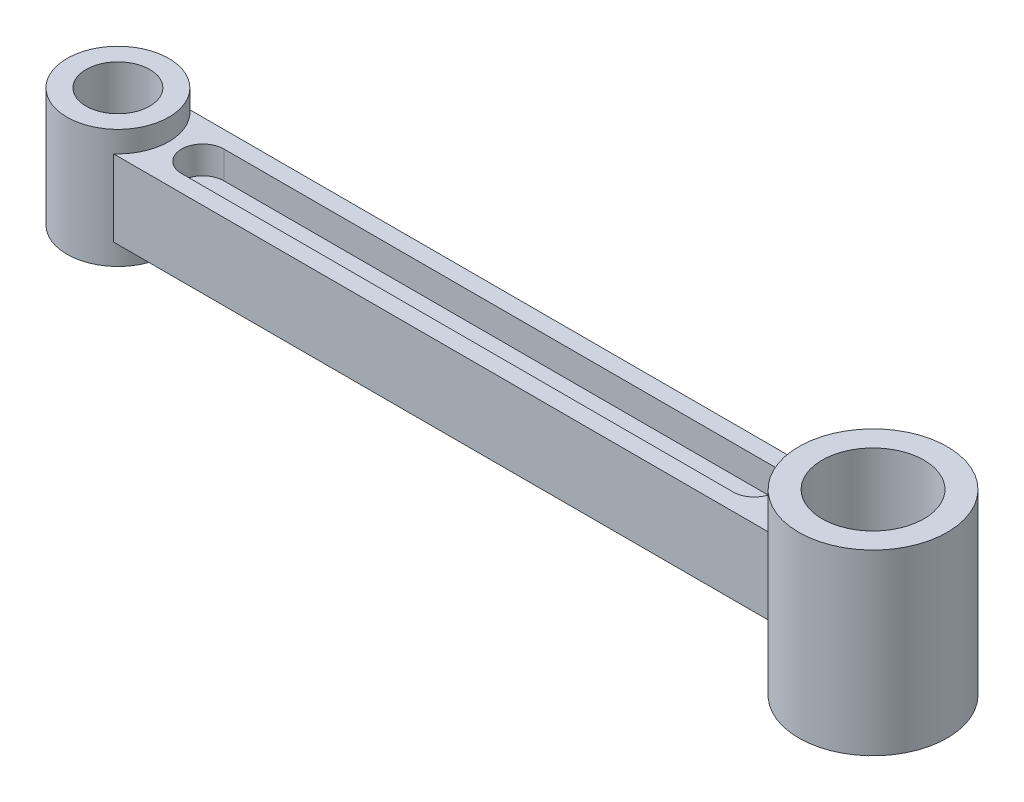
ISO-10303-21;
HEADER;
FILE_DESCRIPTION(('STEP AP214'),'2;1');
FILE_NAME('part.step','',(''),(''),'','','');
FILE_SCHEMA(('AUTOMOTIVE_DESIGN { 1 0 10303 214 1 1 1 1 }'));
ENDSEC;
DATA;
#1=APPLICATION_CONTEXT('core data for automotive mechanical design processes');
#2=APPLICATION_PROTOCOL_DEFINITION('international standard','automotive_design',2000,#1);
#3=PRODUCT_CONTEXT('',#1,'mechanical');
#4=PRODUCT('Part','Part','',(#3));
#5=PRODUCT_RELATED_PRODUCT_CATEGORY('part','',(#4));
#6=PRODUCT_DEFINITION_FORMATION('','',#4);
#7=PRODUCT_DEFINITION_CONTEXT('part definition',#1,'design');
#8=PRODUCT_DEFINITION('design','',#6,#7);
#9=PRODUCT_DEFINITION_SHAPE('','',#8);
#10=(LENGTH_UNIT() NAMED_UNIT(*) SI_UNIT(.MILLI.,.METRE.));
#11=(NAMED_UNIT(*) PLANE_ANGLE_UNIT() SI_UNIT($,.RADIAN.));
#12=(NAMED_UNIT(*) SI_UNIT($,.STERADIAN.) SOLID_ANGLE_UNIT());
#13=UNCERTAINTY_MEASURE_WITH_UNIT(LENGTH_MEASURE(1.E-05),#10,'distance_accuracy_value','');
#14=(GEOMETRIC_REPRESENTATION_CONTEXT(3) GLOBAL_UNCERTAINTY_ASSIGNED_CONTEXT((#13)) GLOBAL_UNIT_ASSIGNED_CONTEXT((#10,
#11,#12)) REPRESENTATION_CONTEXT('',''));
#15=CARTESIAN_POINT('',(0.,0.,0.));
#16=DIRECTION('',(0.,0.,1.));
#17=DIRECTION('',(1.,0.,0.));
#18=AXIS2_PLACEMENT_3D('',#15,#16,#17);
#19=CARTESIAN_POINT('',(69.003011604365,-8.99999999999999,0.));
#20=DIRECTION('',(0.,-1.,0.));
#21=DIRECTION('',(0.,0.,-1.));
#22=AXIS2_PLACEMENT_3D('',#19,#20,#21);
#23=PLANE('',#22);
#24=CARTESIAN_POINT('',(69.003011604365,-8.99999999999999,0.));
#25=DIRECTION('',(0.,-1.,0.));
#26=DIRECTION('',(0.,0.,-1.));
#27=AXIS2_PLACEMENT_3D('',#24,#25,#26);
#28=CIRCLE('',#27,17.5);
#29=CARTESIAN_POINT('',(53.9946805845614,-8.99999999999999,9.00000000000001));
#30=VERTEX_POINT('',#29);
#31=CARTESIAN_POINT('',(53.9946805845614,-8.99999999999999,-9.00000000000001));
#32=VERTEX_POINT('',#31);
#33=EDGE_CURVE('E240',#30,#32,#28,.T.);
#34=ORIENTED_EDGE('',*,*,#33,.F.);
#35=DIRECTION('',(1.,0.,0.));
#36=VECTOR('',#35,1.);
#37=CARTESIAN_POINT('',(53.9946805845614,-8.99999999999999,9.00000000000001));
#38=LINE('',#37,#36);
#39=CARTESIAN_POINT('',(-101.059734462441,-8.99999999999999,9.00000000000001));
#40=VERTEX_POINT('',#39);
#41=EDGE_CURVE('E249',#40,#30,#38,.T.);
#42=ORIENTED_EDGE('',*,*,#41,.F.);
#43=CARTESIAN_POINT('',(-108.996988395635,-8.99999999999999,0.));
#44=DIRECTION('',(0.,-1.,0.));
#45=DIRECTION('',(0.,0.,-1.));
#46=AXIS2_PLACEMENT_3D('',#43,#44,#45);
#47=CIRCLE('',#46,12.);
#48=CARTESIAN_POINT('',(-101.059734462441,-8.99999999999999,-9.00000000000001));
#49=VERTEX_POINT('',#48);
#50=EDGE_CURVE('E265',#49,#40,#47,.T.);
#51=ORIENTED_EDGE('',*,*,#50,.F.);
#52=DIRECTION('',(-1.,0.,0.));
#53=VECTOR('',#52,1.);
#54=CARTESIAN_POINT('',(53.9946805845614,-8.99999999999999,-9.00000000000001));
#55=LINE('',#54,#53);
#56=EDGE_CURVE('E262',#32,#49,#55,.T.);
#57=ORIENTED_EDGE('',*,*,#56,.F.);
#58=EDGE_LOOP('',(#34,#42,#51,#57));
#59=FACE_BOUND('',#58,.T.);
#60=DIRECTION('',(-1.,0.,0.));
#61=VECTOR('',#60,1.);
#62=CARTESIAN_POINT('',(-88.996988395635,-8.99999999999999,-5.));
#63=LINE('',#62,#61);
#64=CARTESIAN_POINT('',(41.003011604365,-8.99999999999999,-5.));
#65=VERTEX_POINT('',#64);
#66=CARTESIAN_POINT('',(-88.996988395635,-8.99999999999999,-5.));
#67=VERTEX_POINT('',#66);
#68=EDGE_CURVE('E171',#65,#67,#63,.T.);
#69=ORIENTED_EDGE('',*,*,#68,.T.);
#70=CARTESIAN_POINT('',(-88.996988395635,-8.99999999999999,0.));
#71=DIRECTION('',(0.,1.,0.));
#72=DIRECTION('',(0.,0.,1.));
#73=AXIS2_PLACEMENT_3D('',#70,#71,#72);
#74=CIRCLE('',#73,5.);
#75=CARTESIAN_POINT('',(-88.996988395635,-8.99999999999999,5.));
#76=VERTEX_POINT('',#75);
#77=EDGE_CURVE('E59',#67,#76,#74,.T.);
#78=ORIENTED_EDGE('',*,*,#77,.T.);
#79=DIRECTION('',(1.,0.,0.));
#80=VECTOR('',#79,1.);
#81=CARTESIAN_POINT('',(41.003011604365,-8.99999999999999,4.99999999999998));
#82=LINE('',#81,#80);
#83=CARTESIAN_POINT('',(41.003011604365,-8.99999999999999,5.));
#84=VERTEX_POINT('',#83);
#85=EDGE_CURVE('E156',#76,#84,#82,.T.);
#86=ORIENTED_EDGE('',*,*,#85,.T.);
#87=CARTESIAN_POINT('',(41.003011604365,-8.99999999999999,0.));
#88=DIRECTION('',(0.,1.,0.));
#89=DIRECTION('',(0.,0.,1.));
#90=AXIS2_PLACEMENT_3D('',#87,#88,#89);
#91=CIRCLE('',#90,4.99999999999999);
#92=EDGE_CURVE('E162',#84,#65,#91,.T.);
#93=ORIENTED_EDGE('',*,*,#92,.T.);
#94=EDGE_LOOP('',(#69,#78,#86,#93));
#95=FACE_BOUND('',#94,.T.);
#96=ADVANCED_FACE('F43',(#59,#95),#23,.T.);
#97=CARTESIAN_POINT('',(-108.996988395635,14.,0.));
#98=DIRECTION('',(0.,-1.,0.));
#99=DIRECTION('',(0.,0.,-1.));
#100=AXIS2_PLACEMENT_3D('',#97,#98,#99);
#101=CYLINDRICAL_SURFACE('',#100,12.);
#102=CARTESIAN_POINT('',(-108.996988395635,-14.,0.));
#103=DIRECTION('',(0.,1.,0.));
#104=DIRECTION('',(0.,0.,1.));
#105=AXIS2_PLACEMENT_3D('',#102,#103,#104);
#106=CIRCLE('',#105,12.);
#107=CARTESIAN_POINT('',(-108.996988395635,-14.,12.));
#108=VERTEX_POINT('',#107);
#109=EDGE_CURVE('E47',#108,#108,#106,.T.);
#110=ORIENTED_EDGE('',*,*,#109,.T.);
#111=EDGE_LOOP('',(#110));
#112=FACE_BOUND('',#111,.T.);
#113=CARTESIAN_POINT('',(-108.996988395635,14.,0.));
#114=DIRECTION('',(0.,1.,0.));
#115=DIRECTION('',(0.,0.,1.));
#116=AXIS2_PLACEMENT_3D('',#113,#114,#115);
#117=CIRCLE('',#116,12.);
#118=CARTESIAN_POINT('',(-108.996988395635,14.,12.));
#119=VERTEX_POINT('',#118);
#120=EDGE_CURVE('E11',#119,#119,#117,.T.);
#121=ORIENTED_EDGE('',*,*,#120,.F.);
#122=EDGE_LOOP('',(#121));
#123=FACE_BOUND('',#122,.T.);
#124=CARTESIAN_POINT('',(-108.996988395635,9.00000000000001,0.));
#125=DIRECTION('',(0.,-1.,0.));
#126=DIRECTION('',(0.,0.,-1.));
#127=AXIS2_PLACEMENT_3D('',#124,#125,#126);
#128=CIRCLE('',#127,12.);
#129=CARTESIAN_POINT('',(-101.059734462441,9.00000000000001,-9.00000000000001));
#130=VERTEX_POINT('',#129);
#131=CARTESIAN_POINT('',(-101.059734462441,9.00000000000001,9.00000000000001));
#132=VERTEX_POINT('',#131);
#133=EDGE_CURVE('E252',#130,#132,#128,.T.);
#134=ORIENTED_EDGE('',*,*,#133,.F.);
#135=DIRECTION('',(0.,-1.,0.));
#136=VECTOR('',#135,1.);
#137=CARTESIAN_POINT('',(-101.059734462441,9.00000000000001,-9.00000000000001));
#138=LINE('',#137,#136);
#139=EDGE_CURVE('E278',#130,#49,#138,.T.);
#140=ORIENTED_EDGE('',*,*,#139,.T.);
#141=ORIENTED_EDGE('',*,*,#50,.T.);
#142=DIRECTION('',(0.,-1.,0.));
#143=VECTOR('',#142,1.);
#144=CARTESIAN_POINT('',(-101.059734462441,9.00000000000001,9.00000000000001));
#145=LINE('',#144,#143);
#146=EDGE_CURVE('E274',#132,#40,#145,.T.);
#147=ORIENTED_EDGE('',*,*,#146,.F.);
#148=EDGE_LOOP('',(#134,#140,#141,#147));
#149=FACE_BOUND('',#148,.T.);
#150=ADVANCED_FACE('F45',(#112,#123,#149),#101,.T.);
#151=CARTESIAN_POINT('',(-108.996988395635,14.,0.));
#152=DIRECTION('',(0.,1.,0.));
#153=DIRECTION('',(0.,0.,1.));
#154=AXIS2_PLACEMENT_3D('',#151,#152,#153);
#155=PLANE('',#154);
#156=ORIENTED_EDGE('',*,*,#120,.T.);
#157=EDGE_LOOP('',(#156));
#158=FACE_BOUND('',#157,.T.);
#159=CARTESIAN_POINT('',(-108.996988395635,14.,0.));
#160=DIRECTION('',(0.,1.,0.));
#161=DIRECTION('',(0.,0.,1.));
#162=AXIS2_PLACEMENT_3D('',#159,#160,#161);
#163=CIRCLE('',#162,7.5);
#164=CARTESIAN_POINT('',(-108.996988395635,14.,7.5));
#165=VERTEX_POINT('',#164);
#166=EDGE_CURVE('E286',#165,#165,#163,.T.);
#167=ORIENTED_EDGE('',*,*,#166,.F.);
#168=EDGE_LOOP('',(#167));
#169=FACE_BOUND('',#168,.T.);
#170=ADVANCED_FACE('F310',(#158,#169),#155,.T.);
#171=CARTESIAN_POINT('',(-108.996988395635,-14.,0.));
#172=DIRECTION('',(0.,1.,0.));
#173=DIRECTION('',(0.,0.,1.));
#174=AXIS2_PLACEMENT_3D('',#171,#172,#173);
#175=PLANE('',#174);
#176=ORIENTED_EDGE('',*,*,#109,.F.);
#177=EDGE_LOOP('',(#176));
#178=FACE_BOUND('',#177,.T.);
#179=CARTESIAN_POINT('',(-108.996988395635,-14.,0.));
#180=DIRECTION('',(0.,1.,0.));
#181=DIRECTION('',(0.,0.,1.));
#182=AXIS2_PLACEMENT_3D('',#179,#180,#181);
#183=CIRCLE('',#182,7.5);
#184=CARTESIAN_POINT('',(-108.996988395635,-14.,7.5));
#185=VERTEX_POINT('',#184);
#186=EDGE_CURVE('E285',#185,#185,#183,.T.);
#187=ORIENTED_EDGE('',*,*,#186,.T.);
#188=EDGE_LOOP('',(#187));
#189=FACE_BOUND('',#188,.T.);
#190=ADVANCED_FACE('F296',(#178,#189),#175,.F.);
#191=CARTESIAN_POINT('',(-108.996988395635,14.,0.));
#192=DIRECTION('',(0.,-1.,0.));
#193=DIRECTION('',(0.,0.,-1.));
#194=AXIS2_PLACEMENT_3D('',#191,#192,#193);
#195=CYLINDRICAL_SURFACE('',#194,7.5);
#196=ORIENTED_EDGE('',*,*,#166,.T.);
#197=EDGE_LOOP('',(#196));
#198=FACE_BOUND('',#197,.T.);
#199=ORIENTED_EDGE('',*,*,#186,.F.);
#200=EDGE_LOOP('',(#199));
#201=FACE_BOUND('',#200,.T.);
#202=ADVANCED_FACE('F298',(#198,#201),#195,.F.);
#203=CARTESIAN_POINT('',(53.9946805845614,9.00000000000001,-9.00000000000001));
#204=DIRECTION('',(0.,0.,1.));
#205=DIRECTION('',(1.,0.,0.));
#206=AXIS2_PLACEMENT_3D('',#203,#204,#205);
#207=PLANE('',#206);
#208=ORIENTED_EDGE('',*,*,#56,.T.);
#209=ORIENTED_EDGE('',*,*,#139,.F.);
#210=DIRECTION('',(-1.,0.,0.));
#211=VECTOR('',#210,1.);
#212=CARTESIAN_POINT('',(53.9946805845614,9.00000000000001,-9.00000000000001));
#213=LINE('',#212,#211);
#214=CARTESIAN_POINT('',(53.9946805845614,9.00000000000001,-9.00000000000001));
#215=VERTEX_POINT('',#214);
#216=EDGE_CURVE('E248',#215,#130,#213,.T.);
#217=ORIENTED_EDGE('',*,*,#216,.F.);
#218=DIRECTION('',(0.,-1.,0.));
#219=VECTOR('',#218,1.);
#220=CARTESIAN_POINT('',(53.9946805845614,9.00000000000001,-9.00000000000001));
#221=LINE('',#220,#219);
#222=EDGE_CURVE('E282',#215,#32,#221,.T.);
#223=ORIENTED_EDGE('',*,*,#222,.T.);
#224=EDGE_LOOP('',(#208,#209,#217,#223));
#225=FACE_BOUND('',#224,.T.);
#226=ADVANCED_FACE('F300',(#225),#207,.F.);
#227=CARTESIAN_POINT('',(53.9946805845614,9.00000000000001,9.00000000000001));
#228=DIRECTION('',(0.,0.,-1.));
#229=DIRECTION('',(-1.,0.,0.));
#230=AXIS2_PLACEMENT_3D('',#227,#228,#229);
#231=PLANE('',#230);
#232=ORIENTED_EDGE('',*,*,#41,.T.);
#233=DIRECTION('',(0.,-1.,0.));
#234=VECTOR('',#233,1.);
#235=CARTESIAN_POINT('',(53.9946805845614,9.00000000000001,9.00000000000001));
#236=LINE('',#235,#234);
#237=CARTESIAN_POINT('',(53.9946805845614,9.00000000000001,9.00000000000001));
#238=VERTEX_POINT('',#237);
#239=EDGE_CURVE('E258',#238,#30,#236,.T.);
#240=ORIENTED_EDGE('',*,*,#239,.F.);
#241=DIRECTION('',(1.,0.,0.));
#242=VECTOR('',#241,1.);
#243=CARTESIAN_POINT('',(53.9946805845614,9.00000000000001,9.00000000000001));
#244=LINE('',#243,#242);
#245=EDGE_CURVE('E255',#132,#238,#244,.T.);
#246=ORIENTED_EDGE('',*,*,#245,.F.);
#247=ORIENTED_EDGE('',*,*,#146,.T.);
#248=EDGE_LOOP('',(#232,#240,#246,#247));
#249=FACE_BOUND('',#248,.T.);
#250=ADVANCED_FACE('F307',(#249),#231,.F.);
#251=CARTESIAN_POINT('',(69.003011604365,9.00000000000001,0.));
#252=DIRECTION('',(0.,-1.,0.));
#253=DIRECTION('',(0.,0.,-1.));
#254=AXIS2_PLACEMENT_3D('',#251,#252,#253);
#255=PLANE('',#254);
#256=DIRECTION('',(1.,0.,0.));
#257=VECTOR('',#256,1.);
#258=CARTESIAN_POINT('',(41.003011604365,9.00000000000001,4.99999999999998));
#259=LINE('',#258,#257);
#260=CARTESIAN_POINT('',(-88.996988395635,9.00000000000001,5.));
#261=VERTEX_POINT('',#260);
#262=CARTESIAN_POINT('',(41.003011604365,9.00000000000001,5.));
#263=VERTEX_POINT('',#262);
#264=EDGE_CURVE('E205',#261,#263,#259,.T.);
#265=ORIENTED_EDGE('',*,*,#264,.F.);
#266=CARTESIAN_POINT('',(-88.996988395635,9.00000000000001,0.));
#267=DIRECTION('',(0.,1.,0.));
#268=DIRECTION('',(0.,0.,1.));
#269=AXIS2_PLACEMENT_3D('',#266,#267,#268);
#270=CIRCLE('',#269,5.);
#271=CARTESIAN_POINT('',(-88.996988395635,9.00000000000001,-5.));
#272=VERTEX_POINT('',#271);
#273=EDGE_CURVE('E67',#272,#261,#270,.T.);
#274=ORIENTED_EDGE('',*,*,#273,.F.);
#275=DIRECTION('',(-1.,0.,0.));
#276=VECTOR('',#275,1.);
#277=CARTESIAN_POINT('',(-88.996988395635,9.00000000000001,-5.));
#278=LINE('',#277,#276);
#279=CARTESIAN_POINT('',(41.003011604365,9.00000000000001,-5.));
#280=VERTEX_POINT('',#279);
#281=EDGE_CURVE('E190',#280,#272,#278,.T.);
#282=ORIENTED_EDGE('',*,*,#281,.F.);
#283=CARTESIAN_POINT('',(41.003011604365,9.00000000000001,0.));
#284=DIRECTION('',(0.,1.,0.));
#285=DIRECTION('',(0.,0.,1.));
#286=AXIS2_PLACEMENT_3D('',#283,#284,#285);
#287=CIRCLE('',#286,4.99999999999999);
#288=EDGE_CURVE('E209',#263,#280,#287,.T.);
#289=ORIENTED_EDGE('',*,*,#288,.F.);
#290=EDGE_LOOP('',(#265,#274,#282,#289));
#291=FACE_BOUND('',#290,.T.);
#292=CARTESIAN_POINT('',(69.003011604365,9.00000000000001,0.));
#293=DIRECTION('',(0.,-1.,0.));
#294=DIRECTION('',(0.,0.,-1.));
#295=AXIS2_PLACEMENT_3D('',#292,#293,#294);
#296=CIRCLE('',#295,17.5);
#297=EDGE_CURVE('E244',#238,#215,#296,.T.);
#298=ORIENTED_EDGE('',*,*,#297,.T.);
#299=ORIENTED_EDGE('',*,*,#216,.T.);
#300=ORIENTED_EDGE('',*,*,#133,.T.);
#301=ORIENTED_EDGE('',*,*,#245,.T.);
#302=EDGE_LOOP('',(#298,#299,#300,#301));
#303=FACE_BOUND('',#302,.T.);
#304=ADVANCED_FACE('F324',(#291,#303),#255,.F.);
#305=CARTESIAN_POINT('',(69.003011604365,21.,0.));
#306=DIRECTION('',(0.,-1.,0.));
#307=DIRECTION('',(0.,0.,-1.));
#308=AXIS2_PLACEMENT_3D('',#305,#306,#307);
#309=CYLINDRICAL_SURFACE('',#308,17.5);
#310=CARTESIAN_POINT('',(69.003011604365,21.,0.));
#311=DIRECTION('',(0.,1.,0.));
#312=DIRECTION('',(0.,0.,1.));
#313=AXIS2_PLACEMENT_3D('',#310,#311,#312);
#314=CIRCLE('',#313,17.5);
#315=CARTESIAN_POINT('',(69.003011604365,21.,17.5));
#316=VERTEX_POINT('',#315);
#317=EDGE_CURVE('E236',#316,#316,#314,.T.);
#318=ORIENTED_EDGE('',*,*,#317,.F.);
#319=EDGE_LOOP('',(#318));
#320=FACE_BOUND('',#319,.T.);
#321=CARTESIAN_POINT('',(69.003011604365,-21.,0.));
#322=DIRECTION('',(0.,1.,0.));
#323=DIRECTION('',(0.,0.,1.));
#324=AXIS2_PLACEMENT_3D('',#321,#322,#323);
#325=CIRCLE('',#324,17.5);
#326=CARTESIAN_POINT('',(69.003011604365,-21.,17.5));
#327=VERTEX_POINT('',#326);
#328=EDGE_CURVE('E232',#327,#327,#325,.T.);
#329=ORIENTED_EDGE('',*,*,#328,.T.);
#330=EDGE_LOOP('',(#329));
#331=FACE_BOUND('',#330,.T.);
#332=ORIENTED_EDGE('',*,*,#222,.F.);
#333=ORIENTED_EDGE('',*,*,#297,.F.);
#334=ORIENTED_EDGE('',*,*,#239,.T.);
#335=ORIENTED_EDGE('',*,*,#33,.T.);
#336=EDGE_LOOP('',(#332,#333,#334,#335));
#337=FACE_BOUND('',#336,.T.);
#338=ADVANCED_FACE('F331',(#320,#331,#337),#309,.T.);
#339=CARTESIAN_POINT('',(69.003011604365,21.,0.));
#340=DIRECTION('',(0.,1.,0.));
#341=DIRECTION('',(0.,0.,1.));
#342=AXIS2_PLACEMENT_3D('',#339,#340,#341);
#343=PLANE('',#342);
#344=ORIENTED_EDGE('',*,*,#317,.T.);
#345=EDGE_LOOP('',(#344));
#346=FACE_BOUND('',#345,.T.);
#347=CARTESIAN_POINT('',(69.003011604365,21.,0.));
#348=DIRECTION('',(0.,1.,0.));
#349=DIRECTION('',(0.,0.,1.));
#350=AXIS2_PLACEMENT_3D('',#347,#348,#349);
#351=CIRCLE('',#350,12.);
#352=CARTESIAN_POINT('',(69.003011604365,21.,-12.));
#353=VERTEX_POINT('',#352);
#354=EDGE_CURVE('E228',#353,#353,#351,.T.);
#355=ORIENTED_EDGE('',*,*,#354,.F.);
#356=EDGE_LOOP('',(#355));
#357=FACE_BOUND('',#356,.T.);
#358=ADVANCED_FACE('F346',(#346,#357),#343,.T.);
#359=CARTESIAN_POINT('',(69.003011604365,-21.,0.));
#360=DIRECTION('',(0.,1.,0.));
#361=DIRECTION('',(0.,0.,1.));
#362=AXIS2_PLACEMENT_3D('',#359,#360,#361);
#363=PLANE('',#362);
#364=ORIENTED_EDGE('',*,*,#328,.F.);
#365=EDGE_LOOP('',(#364));
#366=FACE_BOUND('',#365,.T.);
#367=CARTESIAN_POINT('',(69.003011604365,-21.,0.));
#368=DIRECTION('',(0.,1.,0.));
#369=DIRECTION('',(0.,0.,1.));
#370=AXIS2_PLACEMENT_3D('',#367,#368,#369);
#371=CIRCLE('',#370,12.);
#372=CARTESIAN_POINT('',(69.003011604365,-21.,-12.));
#373=VERTEX_POINT('',#372);
#374=EDGE_CURVE('E219',#373,#373,#371,.T.);
#375=ORIENTED_EDGE('',*,*,#374,.T.);
#376=EDGE_LOOP('',(#375));
#377=FACE_BOUND('',#376,.T.);
#378=ADVANCED_FACE('F351',(#366,#377),#363,.F.);
#379=CARTESIAN_POINT('',(69.003011604365,21.,0.));
#380=DIRECTION('',(0.,-1.,0.));
#381=DIRECTION('',(0.,0.,-1.));
#382=AXIS2_PLACEMENT_3D('',#379,#380,#381);
#383=CYLINDRICAL_SURFACE('',#382,12.);
#384=CARTESIAN_POINT('',(69.003011604365,21.,-12.));
#385=CARTESIAN_POINT('',(69.003011604365,20.5625,-12.));
#386=CARTESIAN_POINT('',(69.003011604365,20.125,-12.));
#387=CARTESIAN_POINT('',(69.003011604365,19.25,-12.));
#388=CARTESIAN_POINT('',(69.003011604365,18.8125,-12.));
#389=CARTESIAN_POINT('',(69.003011604365,17.9375,-12.));
#390=CARTESIAN_POINT('',(69.003011604365,17.5,-12.));
#391=CARTESIAN_POINT('',(69.003011604365,16.625,-12.));
#392=CARTESIAN_POINT('',(69.003011604365,16.1875,-12.));
#393=CARTESIAN_POINT('',(69.003011604365,15.3125,-12.));
#394=CARTESIAN_POINT('',(69.003011604365,14.875,-12.));
#395=CARTESIAN_POINT('',(69.003011604365,14.,-12.));
#396=CARTESIAN_POINT('',(69.003011604365,13.5625,-12.));
#397=CARTESIAN_POINT('',(69.003011604365,12.6875,-12.));
#398=CARTESIAN_POINT('',(69.003011604365,12.25,-12.));
#399=CARTESIAN_POINT('',(69.003011604365,11.375,-12.));
#400=CARTESIAN_POINT('',(69.003011604365,10.9375,-12.));
#401=CARTESIAN_POINT('',(69.003011604365,10.0625,-12.));
#402=CARTESIAN_POINT('',(69.003011604365,9.62499999999999,-12.));
#403=CARTESIAN_POINT('',(69.003011604365,8.74999999999999,-12.));
#404=CARTESIAN_POINT('',(69.003011604365,8.31249999999999,-12.));
#405=CARTESIAN_POINT('',(69.003011604365,7.43749999999999,-12.));
#406=CARTESIAN_POINT('',(69.003011604365,6.99999999999999,-12.));
#407=CARTESIAN_POINT('',(69.003011604365,6.12499999999999,-12.));
#408=CARTESIAN_POINT('',(69.003011604365,5.68749999999999,-12.));
#409=CARTESIAN_POINT('',(69.003011604365,4.81249999999999,-12.));
#410=CARTESIAN_POINT('',(69.003011604365,4.37499999999999,-12.));
#411=CARTESIAN_POINT('',(69.003011604365,3.49999999999999,-12.));
#412=CARTESIAN_POINT('',(69.003011604365,3.06249999999999,-12.));
#413=CARTESIAN_POINT('',(69.003011604365,2.18749999999999,-12.));
#414=CARTESIAN_POINT('',(69.003011604365,1.74999999999999,-12.));
#415=CARTESIAN_POINT('',(69.003011604365,0.874999999999987,-12.));
#416=CARTESIAN_POINT('',(69.003011604365,0.437499999999987,-12.));
#417=CARTESIAN_POINT('',(69.003011604365,-0.437500000000014,-12.));
#418=CARTESIAN_POINT('',(69.003011604365,-0.875000000000015,-12.));
#419=CARTESIAN_POINT('',(69.003011604365,-1.75000000000002,-12.));
#420=CARTESIAN_POINT('',(69.003011604365,-2.18750000000002,-12.));
#421=CARTESIAN_POINT('',(69.003011604365,-3.06250000000002,-12.));
#422=CARTESIAN_POINT('',(69.003011604365,-3.50000000000001,-12.));
#423=CARTESIAN_POINT('',(69.003011604365,-4.37500000000001,-12.));
#424=CARTESIAN_POINT('',(69.003011604365,-4.81250000000002,-12.));
#425=CARTESIAN_POINT('',(69.003011604365,-5.68750000000002,-12.));
#426=CARTESIAN_POINT('',(69.003011604365,-6.12500000000002,-12.));
#427=CARTESIAN_POINT('',(69.003011604365,-7.00000000000002,-12.));
#428=CARTESIAN_POINT('',(69.003011604365,-7.43750000000001,-12.));
#429=CARTESIAN_POINT('',(69.003011604365,-8.31250000000001,-12.));
#430=CARTESIAN_POINT('',(69.003011604365,-8.75000000000001,-12.));
#431=CARTESIAN_POINT('',(69.003011604365,-9.62500000000001,-12.));
#432=CARTESIAN_POINT('',(69.003011604365,-10.0625,-12.));
#433=CARTESIAN_POINT('',(69.003011604365,-10.9375,-12.));
#434=CARTESIAN_POINT('',(69.003011604365,-11.375,-12.));
#435=CARTESIAN_POINT('',(69.003011604365,-12.25,-12.));
#436=CARTESIAN_POINT('',(69.003011604365,-12.6875,-12.));
#437=CARTESIAN_POINT('',(69.003011604365,-13.5625,-12.));
#438=CARTESIAN_POINT('',(69.003011604365,-14.,-12.));
#439=CARTESIAN_POINT('',(69.003011604365,-14.875,-12.));
#440=CARTESIAN_POINT('',(69.003011604365,-15.3125,-12.));
#441=CARTESIAN_POINT('',(69.003011604365,-16.1875,-12.));
#442=CARTESIAN_POINT('',(69.003011604365,-16.625,-12.));
#443=CARTESIAN_POINT('',(69.003011604365,-17.5,-12.));
#444=CARTESIAN_POINT('',(69.003011604365,-17.9375,-12.));
#445=CARTESIAN_POINT('',(69.003011604365,-18.8125,-12.));
#446=CARTESIAN_POINT('',(69.003011604365,-19.25,-12.));
#447=CARTESIAN_POINT('',(69.003011604365,-20.125,-12.));
#448=CARTESIAN_POINT('',(69.003011604365,-20.5625,-12.));
#449=CARTESIAN_POINT('',(69.003011604365,-21.,-12.));
#450=B_SPLINE_CURVE_WITH_KNOTS('',3,(#384,#385,#386,#387,#388,#389,#390,#391,#392,#393,#394,
#395,#396,#397,#398,#399,#400,#401,#402,#403,#404,#405,#406,#407,#408,#409,#410,#411,#412,#413,
#414,#415,#416,#417,#418,#419,#420,#421,#422,#423,#424,#425,#426,#427,#428,#429,#430,#431,#432,
#433,#434,#435,#436,#437,#438,#439,#440,#441,#442,#443,#444,#445,#446,#447,#448,#449),
.UNSPECIFIED.,.F.,.F.,(4,2,2,2,2,2,2,2,2,2,2,2,2,2,2,2,2,2,2,2,2,2,2,2,2,2,2,2,2,2,2,2,4),(0.,
1.3125,2.625,3.9375,5.25,6.5625,7.875,9.1875,10.5,11.8125,13.125,14.4375,15.75,17.0625,18.375,
19.6875,21.,22.3125,23.625,24.9375,26.25,27.5625,28.875,30.1875,31.5,32.8125,34.125,35.4375,
36.75,38.0625,39.375,40.6875,42.),.UNSPECIFIED.);
#451=EDGE_CURVE('BSEAM358',#353,#373,#450,.T.);
#452=ORIENTED_EDGE('',*,*,#354,.T.);
#453=ORIENTED_EDGE('',*,*,#374,.F.);
#454=ORIENTED_EDGE('',*,*,#451,.T.);
#455=ORIENTED_EDGE('',*,*,#451,.F.);
#456=EDGE_LOOP('',(#452,#454,#453,#455));
#457=FACE_BOUND('',#456,.T.);
#458=ADVANCED_FACE('F358',(#457),#383,.F.);
#459=CARTESIAN_POINT('',(-88.996988395635,2.5,0.));
#460=DIRECTION('',(0.,1.,0.));
#461=DIRECTION('',(0.,0.,1.));
#462=AXIS2_PLACEMENT_3D('',#459,#460,#461);
#463=CYLINDRICAL_SURFACE('',#462,5.);
#464=ORIENTED_EDGE('',*,*,#273,.T.);
#465=DIRECTION('',(0.,1.,0.));
#466=VECTOR('',#465,1.);
#467=CARTESIAN_POINT('',(-88.996988395635,2.5,5.));
#468=LINE('',#467,#466);
#469=CARTESIAN_POINT('',(-88.996988395635,2.5,5.));
#470=VERTEX_POINT('',#469);
#471=EDGE_CURVE('E202',#470,#261,#468,.T.);
#472=ORIENTED_EDGE('',*,*,#471,.F.);
#473=CARTESIAN_POINT('',(-88.996988395635,2.5,0.));
#474=DIRECTION('',(0.,1.,0.));
#475=DIRECTION('',(0.,0.,1.));
#476=AXIS2_PLACEMENT_3D('',#473,#474,#475);
#477=CIRCLE('',#476,5.);
#478=CARTESIAN_POINT('',(-88.996988395635,2.5,-5.));
#479=VERTEX_POINT('',#478);
#480=EDGE_CURVE('E185',#479,#470,#477,.T.);
#481=ORIENTED_EDGE('',*,*,#480,.F.);
#482=DIRECTION('',(0.,1.,0.));
#483=VECTOR('',#482,1.);
#484=CARTESIAN_POINT('',(-88.996988395635,2.5,-5.));
#485=LINE('',#484,#483);
#486=EDGE_CURVE('E216',#479,#272,#485,.T.);
#487=ORIENTED_EDGE('',*,*,#486,.T.);
#488=EDGE_LOOP('',(#464,#472,#481,#487));
#489=FACE_BOUND('',#488,.T.);
#490=ADVANCED_FACE('F363',(#489),#463,.F.);
#491=CARTESIAN_POINT('',(-88.996988395635,2.5,-5.));
#492=DIRECTION('',(0.,0.,-1.));
#493=DIRECTION('',(-1.,0.,0.));
#494=AXIS2_PLACEMENT_3D('',#491,#492,#493);
#495=PLANE('',#494);
#496=ORIENTED_EDGE('',*,*,#281,.T.);
#497=ORIENTED_EDGE('',*,*,#486,.F.);
#498=DIRECTION('',(-1.,0.,0.));
#499=VECTOR('',#498,1.);
#500=CARTESIAN_POINT('',(-88.996988395635,2.5,-5.));
#501=LINE('',#500,#499);
#502=CARTESIAN_POINT('',(41.003011604365,2.5,-5.));
#503=VERTEX_POINT('',#502);
#504=EDGE_CURVE('E198',#503,#479,#501,.T.);
#505=ORIENTED_EDGE('',*,*,#504,.F.);
#506=DIRECTION('',(0.,1.,0.));
#507=VECTOR('',#506,1.);
#508=CARTESIAN_POINT('',(41.003011604365,2.5,-5.));
#509=LINE('',#508,#507);
#510=EDGE_CURVE('E220',#503,#280,#509,.T.);
#511=ORIENTED_EDGE('',*,*,#510,.T.);
#512=EDGE_LOOP('',(#496,#497,#505,#511));
#513=FACE_BOUND('',#512,.T.);
#514=ADVANCED_FACE('F367',(#513),#495,.F.);
#515=CARTESIAN_POINT('',(41.003011604365,2.5,0.));
#516=DIRECTION('',(0.,1.,0.));
#517=DIRECTION('',(0.,0.,1.));
#518=AXIS2_PLACEMENT_3D('',#515,#516,#517);
#519=CYLINDRICAL_SURFACE('',#518,4.99999999999999);
#520=ORIENTED_EDGE('',*,*,#288,.T.);
#521=ORIENTED_EDGE('',*,*,#510,.F.);
#522=CARTESIAN_POINT('',(41.003011604365,2.5,0.));
#523=DIRECTION('',(0.,1.,0.));
#524=DIRECTION('',(0.,0.,1.));
#525=AXIS2_PLACEMENT_3D('',#522,#523,#524);
#526=CIRCLE('',#525,4.99999999999999);
#527=CARTESIAN_POINT('',(41.003011604365,2.5,5.));
#528=VERTEX_POINT('',#527);
#529=EDGE_CURVE('E194',#528,#503,#526,.T.);
#530=ORIENTED_EDGE('',*,*,#529,.F.);
#531=DIRECTION('',(0.,1.,0.));
#532=VECTOR('',#531,1.);
#533=CARTESIAN_POINT('',(41.003011604365,2.5,5.));
#534=LINE('',#533,#532);
#535=EDGE_CURVE('E223',#528,#263,#534,.T.);
#536=ORIENTED_EDGE('',*,*,#535,.T.);
#537=EDGE_LOOP('',(#520,#521,#530,#536));
#538=FACE_BOUND('',#537,.T.);
#539=ADVANCED_FACE('F372',(#538),#519,.F.);
#540=CARTESIAN_POINT('',(41.003011604365,2.5,4.99999999999998));
#541=DIRECTION('',(0.,0.,1.));
#542=DIRECTION('',(1.,0.,0.));
#543=AXIS2_PLACEMENT_3D('',#540,#541,#542);
#544=PLANE('',#543);
#545=ORIENTED_EDGE('',*,*,#264,.T.);
#546=ORIENTED_EDGE('',*,*,#535,.F.);
#547=DIRECTION('',(1.,0.,0.));
#548=VECTOR('',#547,1.);
#549=CARTESIAN_POINT('',(41.003011604365,2.5,4.99999999999998));
#550=LINE('',#549,#548);
#551=EDGE_CURVE('E189',#470,#528,#550,.T.);
#552=ORIENTED_EDGE('',*,*,#551,.F.);
#553=ORIENTED_EDGE('',*,*,#471,.T.);
#554=EDGE_LOOP('',(#545,#546,#552,#553));
#555=FACE_BOUND('',#554,.T.);
#556=ADVANCED_FACE('F368',(#555),#544,.F.);
#557=CARTESIAN_POINT('',(-88.996988395635,2.5,0.));
#558=DIRECTION('',(0.,1.,0.));
#559=DIRECTION('',(0.,0.,1.));
#560=AXIS2_PLACEMENT_3D('',#557,#558,#559);
#561=PLANE('',#560);
#562=ORIENTED_EDGE('',*,*,#480,.T.);
#563=ORIENTED_EDGE('',*,*,#551,.T.);
#564=ORIENTED_EDGE('',*,*,#529,.T.);
#565=ORIENTED_EDGE('',*,*,#504,.T.);
#566=EDGE_LOOP('',(#562,#563,#564,#565));
#567=FACE_BOUND('',#566,.T.);
#568=ADVANCED_FACE('F371',(#567),#561,.T.);
#569=CARTESIAN_POINT('',(-88.996988395635,-2.5,0.));
#570=DIRECTION('',(0.,-1.,0.));
#571=DIRECTION('',(0.,0.,-1.));
#572=AXIS2_PLACEMENT_3D('',#569,#570,#571);
#573=CYLINDRICAL_SURFACE('',#572,5.);
#574=ORIENTED_EDGE('',*,*,#77,.F.);
#575=DIRECTION('',(0.,-1.,0.));
#576=VECTOR('',#575,1.);
#577=CARTESIAN_POINT('',(-88.996988395635,-2.5,-5.));
#578=LINE('',#577,#576);
#579=CARTESIAN_POINT('',(-88.996988395635,-2.5,-5.));
#580=VERTEX_POINT('',#579);
#581=EDGE_CURVE('E138',#580,#67,#578,.T.);
#582=ORIENTED_EDGE('',*,*,#581,.F.);
#583=CARTESIAN_POINT('',(-88.996988395635,-2.5,0.));
#584=DIRECTION('',(0.,1.,0.));
#585=DIRECTION('',(0.,0.,1.));
#586=AXIS2_PLACEMENT_3D('',#583,#584,#585);
#587=CIRCLE('',#586,5.);
#588=CARTESIAN_POINT('',(-88.996988395635,-2.5,5.));
#589=VERTEX_POINT('',#588);
#590=EDGE_CURVE('E146',#580,#589,#587,.T.);
#591=ORIENTED_EDGE('',*,*,#590,.T.);
#592=DIRECTION('',(0.,-1.,0.));
#593=VECTOR('',#592,1.);
#594=CARTESIAN_POINT('',(-88.996988395635,-2.5,5.));
#595=LINE('',#594,#593);
#596=EDGE_CURVE('E177',#589,#76,#595,.T.);
#597=ORIENTED_EDGE('',*,*,#596,.T.);
#598=EDGE_LOOP('',(#574,#582,#591,#597));
#599=FACE_BOUND('',#598,.T.);
#600=ADVANCED_FACE('F149',(#599),#573,.F.);
#601=CARTESIAN_POINT('',(41.003011604365,-2.5,4.99999999999998));
#602=DIRECTION('',(0.,0.,-1.));
#603=DIRECTION('',(-1.,0.,0.));
#604=AXIS2_PLACEMENT_3D('',#601,#602,#603);
#605=PLANE('',#604);
#606=ORIENTED_EDGE('',*,*,#85,.F.);
#607=ORIENTED_EDGE('',*,*,#596,.F.);
#608=DIRECTION('',(1.,0.,0.));
#609=VECTOR('',#608,1.);
#610=CARTESIAN_POINT('',(41.003011604365,-2.5,4.99999999999998));
#611=LINE('',#610,#609);
#612=CARTESIAN_POINT('',(41.003011604365,-2.5,5.));
#613=VERTEX_POINT('',#612);
#614=EDGE_CURVE('E152',#589,#613,#611,.T.);
#615=ORIENTED_EDGE('',*,*,#614,.T.);
#616=DIRECTION('',(0.,-1.,0.));
#617=VECTOR('',#616,1.);
#618=CARTESIAN_POINT('',(41.003011604365,-2.5,5.));
#619=LINE('',#618,#617);
#620=EDGE_CURVE('E180',#613,#84,#619,.T.);
#621=ORIENTED_EDGE('',*,*,#620,.T.);
#622=EDGE_LOOP('',(#606,#607,#615,#621));
#623=FACE_BOUND('',#622,.T.);
#624=ADVANCED_FACE('F385',(#623),#605,.T.);
#625=CARTESIAN_POINT('',(41.003011604365,-2.5,0.));
#626=DIRECTION('',(0.,-1.,0.));
#627=DIRECTION('',(0.,0.,-1.));
#628=AXIS2_PLACEMENT_3D('',#625,#626,#627);
#629=CYLINDRICAL_SURFACE('',#628,4.99999999999999);
#630=ORIENTED_EDGE('',*,*,#92,.F.);
#631=ORIENTED_EDGE('',*,*,#620,.F.);
#632=CARTESIAN_POINT('',(41.003011604365,-2.5,0.));
#633=DIRECTION('',(0.,1.,0.));
#634=DIRECTION('',(0.,0.,1.));
#635=AXIS2_PLACEMENT_3D('',#632,#633,#634);
#636=CIRCLE('',#635,4.99999999999999);
#637=CARTESIAN_POINT('',(41.003011604365,-2.5,-5.));
#638=VERTEX_POINT('',#637);
#639=EDGE_CURVE('E145',#613,#638,#636,.T.);
#640=ORIENTED_EDGE('',*,*,#639,.T.);
#641=DIRECTION('',(0.,-1.,0.));
#642=VECTOR('',#641,1.);
#643=CARTESIAN_POINT('',(41.003011604365,-2.5,-5.));
#644=LINE('',#643,#642);
#645=EDGE_CURVE('E140',#638,#65,#644,.T.);
#646=ORIENTED_EDGE('',*,*,#645,.T.);
#647=EDGE_LOOP('',(#630,#631,#640,#646));
#648=FACE_BOUND('',#647,.T.);
#649=ADVANCED_FACE('F388',(#648),#629,.F.);
#650=CARTESIAN_POINT('',(-88.996988395635,-2.5,-5.));
#651=DIRECTION('',(0.,0.,1.));
#652=DIRECTION('',(1.,0.,0.));
#653=AXIS2_PLACEMENT_3D('',#650,#651,#652);
#654=PLANE('',#653);
#655=ORIENTED_EDGE('',*,*,#68,.F.);
#656=ORIENTED_EDGE('',*,*,#645,.F.);
#657=DIRECTION('',(-1.,0.,0.));
#658=VECTOR('',#657,1.);
#659=CARTESIAN_POINT('',(-88.996988395635,-2.5,-5.));
#660=LINE('',#659,#658);
#661=EDGE_CURVE('E135',#638,#580,#660,.T.);
#662=ORIENTED_EDGE('',*,*,#661,.T.);
#663=ORIENTED_EDGE('',*,*,#581,.T.);
#664=EDGE_LOOP('',(#655,#656,#662,#663));
#665=FACE_BOUND('',#664,.T.);
#666=ADVANCED_FACE('F137',(#665),#654,.T.);
#667=CARTESIAN_POINT('',(-88.996988395635,-2.5,0.));
#668=DIRECTION('',(0.,-1.,0.));
#669=DIRECTION('',(0.,0.,1.));
#670=AXIS2_PLACEMENT_3D('',#667,#668,#669);
#671=PLANE('',#670);
#672=ORIENTED_EDGE('',*,*,#590,.F.);
#673=ORIENTED_EDGE('',*,*,#661,.F.);
#674=ORIENTED_EDGE('',*,*,#639,.F.);
#675=ORIENTED_EDGE('',*,*,#614,.F.);
#676=EDGE_LOOP('',(#672,#673,#674,#675));
#677=FACE_BOUND('',#676,.T.);
#678=ADVANCED_FACE('F154',(#677),#671,.T.);
#679=CLOSED_SHELL('',(#96,#150,#170,#190,#202,#226,#250,#304,#338,#358,#378,#458,#490,#514,#539,
#556,#568,#600,#624,#649,#666,#678));
#680=MANIFOLD_SOLID_BREP('B2',#679);
#681=ADVANCED_BREP_SHAPE_REPRESENTATION('',(#18,#680),#14);
#682=SHAPE_DEFINITION_REPRESENTATION(#9,#681);
ENDSEC;
END-ISO-10303-21;
